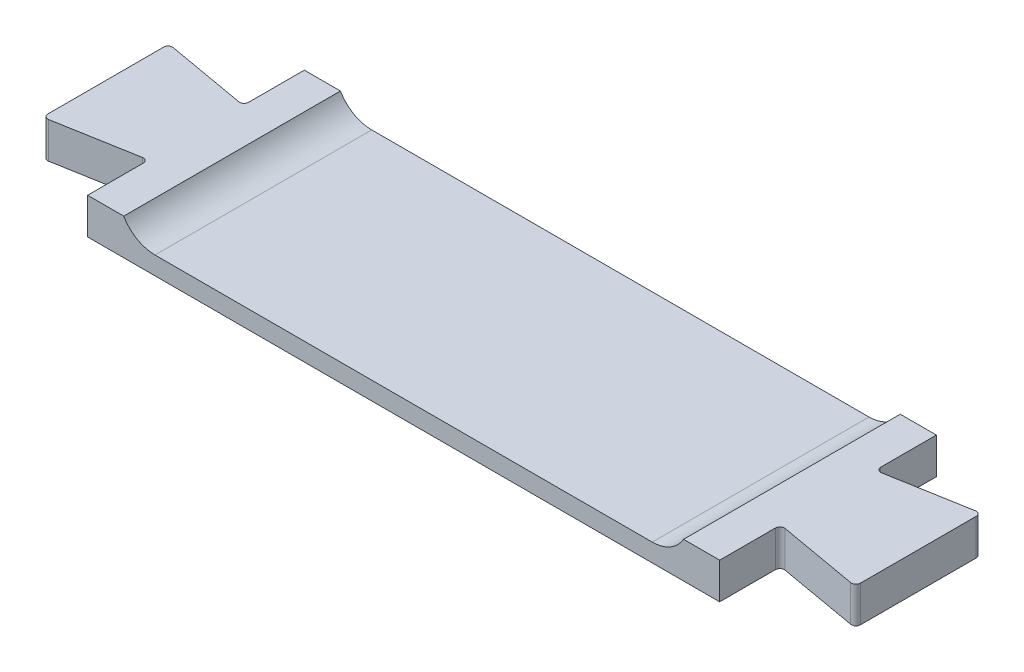
ISO-10303-21;
HEADER;
FILE_DESCRIPTION(('STEP AP214'),'2;1');
FILE_NAME('part.step','',(''),(''),'','','');
FILE_SCHEMA(('AUTOMOTIVE_DESIGN { 1 0 10303 214 1 1 1 1 }'));
ENDSEC;
DATA;
#1=APPLICATION_CONTEXT('core data for automotive mechanical design processes');
#2=APPLICATION_PROTOCOL_DEFINITION('international standard','automotive_design',2000,#1);
#3=PRODUCT_CONTEXT('',#1,'mechanical');
#4=PRODUCT('Part','Part','',(#3));
#5=PRODUCT_RELATED_PRODUCT_CATEGORY('part','',(#4));
#6=PRODUCT_DEFINITION_FORMATION('','',#4);
#7=PRODUCT_DEFINITION_CONTEXT('part definition',#1,'design');
#8=PRODUCT_DEFINITION('design','',#6,#7);
#9=PRODUCT_DEFINITION_SHAPE('','',#8);
#10=(LENGTH_UNIT() NAMED_UNIT(*) SI_UNIT(.MILLI.,.METRE.));
#11=(NAMED_UNIT(*) PLANE_ANGLE_UNIT() SI_UNIT($,.RADIAN.));
#12=(NAMED_UNIT(*) SI_UNIT($,.STERADIAN.) SOLID_ANGLE_UNIT());
#13=UNCERTAINTY_MEASURE_WITH_UNIT(LENGTH_MEASURE(1.E-05),#10,'distance_accuracy_value','');
#14=(GEOMETRIC_REPRESENTATION_CONTEXT(3) GLOBAL_UNCERTAINTY_ASSIGNED_CONTEXT((#13)) GLOBAL_UNIT_ASSIGNED_CONTEXT((#10,
#11,#12)) REPRESENTATION_CONTEXT('',''));
#15=CARTESIAN_POINT('',(0.,0.,0.));
#16=DIRECTION('',(0.,0.,1.));
#17=DIRECTION('',(1.,0.,0.));
#18=AXIS2_PLACEMENT_3D('',#15,#16,#17);
#19=CARTESIAN_POINT('',(0.,2.,0.));
#20=DIRECTION('',(0.,-1.,0.));
#21=DIRECTION('',(0.,0.,-1.));
#22=AXIS2_PLACEMENT_3D('',#19,#20,#21);
#23=PLANE('',#22);
#24=DIRECTION('',(1.,0.,0.));
#25=VECTOR('',#24,1.);
#26=CARTESIAN_POINT('',(-17.5,2.,6.));
#27=LINE('',#26,#25);
#28=CARTESIAN_POINT('',(-17.5,2.,6.));
#29=VERTEX_POINT('',#28);
#30=CARTESIAN_POINT('',(-15.5,2.,6.));
#31=VERTEX_POINT('',#30);
#32=EDGE_CURVE('E201',#29,#31,#27,.T.);
#33=ORIENTED_EDGE('',*,*,#32,.T.);
#34=DIRECTION('',(0.,0.,1.));
#35=VECTOR('',#34,1.);
#36=CARTESIAN_POINT('',(-15.5,2.,-6.));
#37=LINE('',#36,#35);
#38=CARTESIAN_POINT('',(-15.5,2.,-6.));
#39=VERTEX_POINT('',#38);
#40=EDGE_CURVE('E211',#39,#31,#37,.T.);
#41=ORIENTED_EDGE('',*,*,#40,.F.);
#42=DIRECTION('',(-1.,0.,0.));
#43=VECTOR('',#42,1.);
#44=CARTESIAN_POINT('',(-17.5,2.,-6.));
#45=LINE('',#44,#43);
#46=CARTESIAN_POINT('',(-17.5,2.,-6.));
#47=VERTEX_POINT('',#46);
#48=EDGE_CURVE('E228',#39,#47,#45,.T.);
#49=ORIENTED_EDGE('',*,*,#48,.T.);
#50=DIRECTION('',(0.,0.,1.));
#51=VECTOR('',#50,1.);
#52=CARTESIAN_POINT('',(-17.5,2.,-2.61836509645765));
#53=LINE('',#52,#51);
#54=CARTESIAN_POINT('',(-17.5,2.,-2.91630349460621));
#55=VERTEX_POINT('',#54);
#56=EDGE_CURVE('E233',#47,#55,#53,.T.);
#57=ORIENTED_EDGE('',*,*,#56,.T.);
#58=CARTESIAN_POINT('',(-17.75,2.,-2.91630349460621));
#59=DIRECTION('',(0.,-1.,0.));
#60=DIRECTION('',(0.,0.,-1.));
#61=AXIS2_PLACEMENT_3D('',#58,#59,#60);
#62=CIRCLE('',#61,0.25);
#63=CARTESIAN_POINT('',(-17.7934120444167,2.,-2.67010155635315));
#64=VERTEX_POINT('',#63);
#65=EDGE_CURVE('E361',#55,#64,#62,.T.);
#66=ORIENTED_EDGE('',*,*,#65,.T.);
#67=DIRECTION('',(-0.984807753012207,0.,-0.173648177666934));
#68=VECTOR('',#67,1.);
#69=CARTESIAN_POINT('',(-17.5,2.,-2.61836509645765));
#70=LINE('',#69,#68);
#71=CARTESIAN_POINT('',(-22.2065879555833,2.,-3.4482635401045));
#72=VERTEX_POINT('',#71);
#73=EDGE_CURVE('E236',#64,#72,#70,.T.);
#74=ORIENTED_EDGE('',*,*,#73,.T.);
#75=CARTESIAN_POINT('',(-22.25,2.,-3.20206160185144));
#76=DIRECTION('',(0.,-1.,0.));
#77=DIRECTION('',(0.,0.,-1.));
#78=AXIS2_PLACEMENT_3D('',#75,#76,#77);
#79=CIRCLE('',#78,0.25);
#80=CARTESIAN_POINT('',(-22.5,2.,-3.20206160185144));
#81=VERTEX_POINT('',#80);
#82=EDGE_CURVE('E324',#72,#81,#79,.F.);
#83=ORIENTED_EDGE('',*,*,#82,.T.);
#84=DIRECTION('',(0.,0.,1.));
#85=VECTOR('',#84,1.);
#86=CARTESIAN_POINT('',(-22.5,2.,-3.5));
#87=LINE('',#86,#85);
#88=CARTESIAN_POINT('',(-22.5,2.,3.20206160185145));
#89=VERTEX_POINT('',#88);
#90=EDGE_CURVE('E239',#81,#89,#87,.T.);
#91=ORIENTED_EDGE('',*,*,#90,.T.);
#92=CARTESIAN_POINT('',(-22.25,2.,3.20206160185145));
#93=DIRECTION('',(0.,-1.,0.));
#94=DIRECTION('',(0.,0.,-1.));
#95=AXIS2_PLACEMENT_3D('',#92,#93,#94);
#96=CIRCLE('',#95,0.25);
#97=CARTESIAN_POINT('',(-22.2065879555833,2.,3.4482635401045));
#98=VERTEX_POINT('',#97);
#99=EDGE_CURVE('E326',#89,#98,#96,.F.);
#100=ORIENTED_EDGE('',*,*,#99,.T.);
#101=DIRECTION('',(0.984807753012207,0.,-0.173648177666935));
#102=VECTOR('',#101,1.);
#103=CARTESIAN_POINT('',(-17.5,2.,2.61836509645765));
#104=LINE('',#103,#102);
#105=CARTESIAN_POINT('',(-17.7934120444167,2.,2.67010155635316));
#106=VERTEX_POINT('',#105);
#107=EDGE_CURVE('E242',#98,#106,#104,.T.);
#108=ORIENTED_EDGE('',*,*,#107,.T.);
#109=CARTESIAN_POINT('',(-17.75,2.,2.91630349460621));
#110=DIRECTION('',(0.,-1.,0.));
#111=DIRECTION('',(0.,0.,-1.));
#112=AXIS2_PLACEMENT_3D('',#109,#110,#111);
#113=CIRCLE('',#112,0.25);
#114=CARTESIAN_POINT('',(-17.5,2.,2.91630349460621));
#115=VERTEX_POINT('',#114);
#116=EDGE_CURVE('E357',#106,#115,#113,.T.);
#117=ORIENTED_EDGE('',*,*,#116,.T.);
#118=DIRECTION('',(0.,0.,1.));
#119=VECTOR('',#118,1.);
#120=CARTESIAN_POINT('',(-17.5,2.,6.));
#121=LINE('',#120,#119);
#122=EDGE_CURVE('E213',#115,#29,#121,.T.);
#123=ORIENTED_EDGE('',*,*,#122,.T.);
#124=EDGE_LOOP('',(#33,#41,#49,#57,#66,#74,#83,#91,#100,#108,#117,#123));
#125=FACE_BOUND('',#124,.T.);
#126=ADVANCED_FACE('F35',(#125),#23,.F.);
#127=CARTESIAN_POINT('',(17.5,2.,-2.61836509645766));
#128=DIRECTION('',(-1.,0.,0.));
#129=DIRECTION('',(0.,0.,1.));
#130=AXIS2_PLACEMENT_3D('',#127,#128,#129);
#131=PLANE('',#130);
#132=DIRECTION('',(0.,0.,-1.));
#133=VECTOR('',#132,1.);
#134=CARTESIAN_POINT('',(17.5,2.,-2.61836509645766));
#135=LINE('',#134,#133);
#136=CARTESIAN_POINT('',(17.5,2.,-2.91630349460621));
#137=VERTEX_POINT('',#136);
#138=CARTESIAN_POINT('',(17.5,2.,-6.));
#139=VERTEX_POINT('',#138);
#140=EDGE_CURVE('E226',#137,#139,#135,.T.);
#141=ORIENTED_EDGE('',*,*,#140,.F.);
#142=DIRECTION('',(0.,-1.,0.));
#143=VECTOR('',#142,1.);
#144=CARTESIAN_POINT('',(17.5,0.,-2.91630349460621));
#145=LINE('',#144,#143);
#146=CARTESIAN_POINT('',(17.5,0.,-2.91630349460621));
#147=VERTEX_POINT('',#146);
#148=EDGE_CURVE('E335',#137,#147,#145,.T.);
#149=ORIENTED_EDGE('',*,*,#148,.T.);
#150=DIRECTION('',(0.,0.,-1.));
#151=VECTOR('',#150,1.);
#152=CARTESIAN_POINT('',(17.5,0.,-2.61836509645766));
#153=LINE('',#152,#151);
#154=CARTESIAN_POINT('',(17.5,0.,-6.));
#155=VERTEX_POINT('',#154);
#156=EDGE_CURVE('E258',#147,#155,#153,.T.);
#157=ORIENTED_EDGE('',*,*,#156,.T.);
#158=DIRECTION('',(0.,-1.,0.));
#159=VECTOR('',#158,1.);
#160=CARTESIAN_POINT('',(17.5,2.,-6.));
#161=LINE('',#160,#159);
#162=EDGE_CURVE('E296',#139,#155,#161,.T.);
#163=ORIENTED_EDGE('',*,*,#162,.F.);
#164=EDGE_LOOP('',(#141,#149,#157,#163));
#165=FACE_BOUND('',#164,.T.);
#166=ADVANCED_FACE('F397',(#165),#131,.F.);
#167=CARTESIAN_POINT('',(-17.5,2.,-6.));
#168=DIRECTION('',(0.,0.,1.));
#169=DIRECTION('',(1.,0.,0.));
#170=AXIS2_PLACEMENT_3D('',#167,#168,#169);
#171=PLANE('',#170);
#172=ORIENTED_EDGE('',*,*,#48,.F.);
#173=CARTESIAN_POINT('',(-13.7679491924311,3.,-6.));
#174=DIRECTION('',(0.,0.,1.));
#175=DIRECTION('',(1.,0.,0.));
#176=AXIS2_PLACEMENT_3D('',#173,#174,#175);
#177=CIRCLE('',#176,2.);
#178=CARTESIAN_POINT('',(-13.7679491924311,1.,-6.));
#179=VERTEX_POINT('',#178);
#180=EDGE_CURVE('E50',#39,#179,#177,.T.);
#181=ORIENTED_EDGE('',*,*,#180,.T.);
#182=DIRECTION('',(-1.,0.,0.));
#183=VECTOR('',#182,1.);
#184=CARTESIAN_POINT('',(-15.5,1.,-6.));
#185=LINE('',#184,#183);
#186=CARTESIAN_POINT('',(13.7679491924311,1.,-6.));
#187=VERTEX_POINT('',#186);
#188=EDGE_CURVE('E223',#187,#179,#185,.T.);
#189=ORIENTED_EDGE('',*,*,#188,.F.);
#190=CARTESIAN_POINT('',(13.7679491924311,3.,-6.));
#191=DIRECTION('',(0.,0.,1.));
#192=DIRECTION('',(1.,0.,0.));
#193=AXIS2_PLACEMENT_3D('',#190,#191,#192);
#194=CIRCLE('',#193,2.);
#195=CARTESIAN_POINT('',(15.5,2.,-6.));
#196=VERTEX_POINT('',#195);
#197=EDGE_CURVE('E43',#187,#196,#194,.T.);
#198=ORIENTED_EDGE('',*,*,#197,.T.);
#199=EDGE_CURVE('E230',#139,#196,#45,.T.);
#200=ORIENTED_EDGE('',*,*,#199,.F.);
#201=ORIENTED_EDGE('',*,*,#162,.T.);
#202=DIRECTION('',(-1.,0.,0.));
#203=VECTOR('',#202,1.);
#204=CARTESIAN_POINT('',(-17.5,0.,-6.));
#205=LINE('',#204,#203);
#206=CARTESIAN_POINT('',(-17.5,0.,-6.));
#207=VERTEX_POINT('',#206);
#208=EDGE_CURVE('E260',#155,#207,#205,.T.);
#209=ORIENTED_EDGE('',*,*,#208,.T.);
#210=DIRECTION('',(0.,-1.,0.));
#211=VECTOR('',#210,1.);
#212=CARTESIAN_POINT('',(-17.5,2.,-6.));
#213=LINE('',#212,#211);
#214=EDGE_CURVE('E293',#47,#207,#213,.T.);
#215=ORIENTED_EDGE('',*,*,#214,.F.);
#216=EDGE_LOOP('',(#172,#181,#189,#198,#200,#201,#209,#215));
#217=FACE_BOUND('',#216,.T.);
#218=ADVANCED_FACE('F375',(#217),#171,.F.);
#219=CARTESIAN_POINT('',(-17.5,2.,-2.61836509645765));
#220=DIRECTION('',(1.,0.,0.));
#221=DIRECTION('',(0.,0.,-1.));
#222=AXIS2_PLACEMENT_3D('',#219,#220,#221);
#223=PLANE('',#222);
#224=DIRECTION('',(0.,0.,1.));
#225=VECTOR('',#224,1.);
#226=CARTESIAN_POINT('',(-17.5,0.,-2.61836509645765));
#227=LINE('',#226,#225);
#228=CARTESIAN_POINT('',(-17.5,0.,-2.91630349460621));
#229=VERTEX_POINT('',#228);
#230=EDGE_CURVE('E262',#207,#229,#227,.T.);
#231=ORIENTED_EDGE('',*,*,#230,.T.);
#232=DIRECTION('',(0.,-1.,0.));
#233=VECTOR('',#232,1.);
#234=CARTESIAN_POINT('',(-17.5,2.,-2.91630349460621));
#235=LINE('',#234,#233);
#236=EDGE_CURVE('E333',#229,#55,#235,.F.);
#237=ORIENTED_EDGE('',*,*,#236,.T.);
#238=ORIENTED_EDGE('',*,*,#56,.F.);
#239=ORIENTED_EDGE('',*,*,#214,.T.);
#240=EDGE_LOOP('',(#231,#237,#238,#239));
#241=FACE_BOUND('',#240,.T.);
#242=ADVANCED_FACE('F447',(#241),#223,.F.);
#243=CARTESIAN_POINT('',(-17.5,2.,-2.61836509645765));
#244=DIRECTION('',(-0.173648177666934,0.,0.984807753012207));
#245=DIRECTION('',(0.984807753012208,0.,0.173648177666934));
#246=AXIS2_PLACEMENT_3D('',#243,#244,#245);
#247=PLANE('',#246);
#248=DIRECTION('',(-0.984807753012207,0.,-0.173648177666934));
#249=VECTOR('',#248,1.);
#250=CARTESIAN_POINT('',(-17.5,0.,-2.61836509645765));
#251=LINE('',#250,#249);
#252=CARTESIAN_POINT('',(-17.7934120444167,0.,-2.67010155635315));
#253=VERTEX_POINT('',#252);
#254=CARTESIAN_POINT('',(-22.2065879555833,0.,-3.4482635401045));
#255=VERTEX_POINT('',#254);
#256=EDGE_CURVE('E265',#253,#255,#251,.T.);
#257=ORIENTED_EDGE('',*,*,#256,.T.);
#258=DIRECTION('',(0.,-1.,0.));
#259=VECTOR('',#258,1.);
#260=CARTESIAN_POINT('',(-22.2065879555833,2.,-3.4482635401045));
#261=LINE('',#260,#259);
#262=EDGE_CURVE('E331',#255,#72,#261,.F.);
#263=ORIENTED_EDGE('',*,*,#262,.T.);
#264=ORIENTED_EDGE('',*,*,#73,.F.);
#265=DIRECTION('',(0.,-1.,0.));
#266=VECTOR('',#265,1.);
#267=CARTESIAN_POINT('',(-17.7934120444167,0.,-2.67010155635315));
#268=LINE('',#267,#266);
#269=EDGE_CURVE('E328',#64,#253,#268,.T.);
#270=ORIENTED_EDGE('',*,*,#269,.T.);
#271=EDGE_LOOP('',(#257,#263,#264,#270));
#272=FACE_BOUND('',#271,.T.);
#273=ADVANCED_FACE('F443',(#272),#247,.F.);
#274=CARTESIAN_POINT('',(-22.5,2.,-3.5));
#275=DIRECTION('',(1.,0.,0.));
#276=DIRECTION('',(0.,0.,-1.));
#277=AXIS2_PLACEMENT_3D('',#274,#275,#276);
#278=PLANE('',#277);
#279=DIRECTION('',(0.,0.,1.));
#280=VECTOR('',#279,1.);
#281=CARTESIAN_POINT('',(-22.5,0.,-3.5));
#282=LINE('',#281,#280);
#283=CARTESIAN_POINT('',(-22.5,0.,-3.20206160185144));
#284=VERTEX_POINT('',#283);
#285=CARTESIAN_POINT('',(-22.5,0.,3.20206160185145));
#286=VERTEX_POINT('',#285);
#287=EDGE_CURVE('E268',#284,#286,#282,.T.);
#288=ORIENTED_EDGE('',*,*,#287,.T.);
#289=DIRECTION('',(0.,-1.,0.));
#290=VECTOR('',#289,1.);
#291=CARTESIAN_POINT('',(-22.5,2.,3.20206160185145));
#292=LINE('',#291,#290);
#293=EDGE_CURVE('E318',#286,#89,#292,.F.);
#294=ORIENTED_EDGE('',*,*,#293,.T.);
#295=ORIENTED_EDGE('',*,*,#90,.F.);
#296=DIRECTION('',(0.,-1.,0.));
#297=VECTOR('',#296,1.);
#298=CARTESIAN_POINT('',(-22.5,2.,-3.20206160185144));
#299=LINE('',#298,#297);
#300=EDGE_CURVE('E315',#81,#284,#299,.T.);
#301=ORIENTED_EDGE('',*,*,#300,.T.);
#302=EDGE_LOOP('',(#288,#294,#295,#301));
#303=FACE_BOUND('',#302,.T.);
#304=ADVANCED_FACE('F439',(#303),#278,.F.);
#305=CARTESIAN_POINT('',(-17.5,2.,2.61836509645765));
#306=DIRECTION('',(-0.173648177666935,0.,-0.984807753012207));
#307=DIRECTION('',(-0.984807753012207,0.,0.173648177666935));
#308=AXIS2_PLACEMENT_3D('',#305,#306,#307);
#309=PLANE('',#308);
#310=DIRECTION('',(0.984807753012207,0.,-0.173648177666935));
#311=VECTOR('',#310,1.);
#312=CARTESIAN_POINT('',(-17.5,0.,2.61836509645765));
#313=LINE('',#312,#311);
#314=CARTESIAN_POINT('',(-22.2065879555833,0.,3.4482635401045));
#315=VERTEX_POINT('',#314);
#316=CARTESIAN_POINT('',(-17.7934120444167,0.,2.67010155635316));
#317=VERTEX_POINT('',#316);
#318=EDGE_CURVE('E271',#315,#317,#313,.T.);
#319=ORIENTED_EDGE('',*,*,#318,.T.);
#320=DIRECTION('',(0.,-1.,0.));
#321=VECTOR('',#320,1.);
#322=CARTESIAN_POINT('',(-17.7934120444167,2.,2.67010155635316));
#323=LINE('',#322,#321);
#324=EDGE_CURVE('E305',#317,#106,#323,.F.);
#325=ORIENTED_EDGE('',*,*,#324,.T.);
#326=ORIENTED_EDGE('',*,*,#107,.F.);
#327=DIRECTION('',(0.,-1.,0.));
#328=VECTOR('',#327,1.);
#329=CARTESIAN_POINT('',(-22.2065879555833,2.,3.4482635401045));
#330=LINE('',#329,#328);
#331=EDGE_CURVE('E302',#98,#315,#330,.T.);
#332=ORIENTED_EDGE('',*,*,#331,.T.);
#333=EDGE_LOOP('',(#319,#325,#326,#332));
#334=FACE_BOUND('',#333,.T.);
#335=ADVANCED_FACE('F435',(#334),#309,.F.);
#336=CARTESIAN_POINT('',(-17.5,2.,6.));
#337=DIRECTION('',(1.,0.,0.));
#338=DIRECTION('',(0.,0.,-1.));
#339=AXIS2_PLACEMENT_3D('',#336,#337,#338);
#340=PLANE('',#339);
#341=ORIENTED_EDGE('',*,*,#122,.F.);
#342=DIRECTION('',(0.,-1.,0.));
#343=VECTOR('',#342,1.);
#344=CARTESIAN_POINT('',(-17.5,0.,2.91630349460621));
#345=LINE('',#344,#343);
#346=CARTESIAN_POINT('',(-17.5,0.,2.91630349460621));
#347=VERTEX_POINT('',#346);
#348=EDGE_CURVE('E299',#115,#347,#345,.T.);
#349=ORIENTED_EDGE('',*,*,#348,.T.);
#350=DIRECTION('',(0.,0.,1.));
#351=VECTOR('',#350,1.);
#352=CARTESIAN_POINT('',(-17.5,0.,6.));
#353=LINE('',#352,#351);
#354=CARTESIAN_POINT('',(-17.5,0.,6.));
#355=VERTEX_POINT('',#354);
#356=EDGE_CURVE('E274',#347,#355,#353,.T.);
#357=ORIENTED_EDGE('',*,*,#356,.T.);
#358=DIRECTION('',(0.,-1.,0.));
#359=VECTOR('',#358,1.);
#360=CARTESIAN_POINT('',(-17.5,2.,6.));
#361=LINE('',#360,#359);
#362=EDGE_CURVE('E291',#29,#355,#361,.T.);
#363=ORIENTED_EDGE('',*,*,#362,.F.);
#364=EDGE_LOOP('',(#341,#349,#357,#363));
#365=FACE_BOUND('',#364,.T.);
#366=ADVANCED_FACE('F432',(#365),#340,.F.);
#367=CARTESIAN_POINT('',(-17.5,2.,6.));
#368=DIRECTION('',(0.,0.,-1.));
#369=DIRECTION('',(-1.,0.,0.));
#370=AXIS2_PLACEMENT_3D('',#367,#368,#369);
#371=PLANE('',#370);
#372=DIRECTION('',(1.,0.,0.));
#373=VECTOR('',#372,1.);
#374=CARTESIAN_POINT('',(-15.5,1.,6.));
#375=LINE('',#374,#373);
#376=CARTESIAN_POINT('',(-13.7679491924311,1.,6.));
#377=VERTEX_POINT('',#376);
#378=CARTESIAN_POINT('',(13.7679491924311,1.,6.));
#379=VERTEX_POINT('',#378);
#380=EDGE_CURVE('E203',#377,#379,#375,.T.);
#381=ORIENTED_EDGE('',*,*,#380,.F.);
#382=CARTESIAN_POINT('',(-13.7679491924311,3.,6.));
#383=DIRECTION('',(0.,0.,-1.));
#384=DIRECTION('',(-1.,0.,0.));
#385=AXIS2_PLACEMENT_3D('',#382,#383,#384);
#386=CIRCLE('',#385,2.);
#387=EDGE_CURVE('E197',#377,#31,#386,.T.);
#388=ORIENTED_EDGE('',*,*,#387,.T.);
#389=ORIENTED_EDGE('',*,*,#32,.F.);
#390=ORIENTED_EDGE('',*,*,#362,.T.);
#391=DIRECTION('',(1.,0.,0.));
#392=VECTOR('',#391,1.);
#393=CARTESIAN_POINT('',(-17.5,0.,6.));
#394=LINE('',#393,#392);
#395=CARTESIAN_POINT('',(17.5,0.,6.));
#396=VERTEX_POINT('',#395);
#397=EDGE_CURVE('E276',#355,#396,#394,.T.);
#398=ORIENTED_EDGE('',*,*,#397,.T.);
#399=DIRECTION('',(0.,-1.,0.));
#400=VECTOR('',#399,1.);
#401=CARTESIAN_POINT('',(17.5,2.,6.));
#402=LINE('',#401,#400);
#403=CARTESIAN_POINT('',(17.5,2.,6.));
#404=VERTEX_POINT('',#403);
#405=EDGE_CURVE('E257',#404,#396,#402,.T.);
#406=ORIENTED_EDGE('',*,*,#405,.F.);
#407=CARTESIAN_POINT('',(15.5,2.,6.));
#408=VERTEX_POINT('',#407);
#409=EDGE_CURVE('E216',#408,#404,#27,.T.);
#410=ORIENTED_EDGE('',*,*,#409,.F.);
#411=CARTESIAN_POINT('',(13.7679491924311,3.,6.));
#412=DIRECTION('',(0.,0.,-1.));
#413=DIRECTION('',(-1.,0.,0.));
#414=AXIS2_PLACEMENT_3D('',#411,#412,#413);
#415=CIRCLE('',#414,2.);
#416=EDGE_CURVE('E11',#408,#379,#415,.T.);
#417=ORIENTED_EDGE('',*,*,#416,.T.);
#418=EDGE_LOOP('',(#381,#388,#389,#390,#398,#406,#410,#417));
#419=FACE_BOUND('',#418,.T.);
#420=ADVANCED_FACE('F199',(#419),#371,.F.);
#421=CARTESIAN_POINT('',(17.5,2.,6.));
#422=DIRECTION('',(-1.,0.,0.));
#423=DIRECTION('',(0.,0.,1.));
#424=AXIS2_PLACEMENT_3D('',#421,#422,#423);
#425=PLANE('',#424);
#426=DIRECTION('',(0.,0.,-1.));
#427=VECTOR('',#426,1.);
#428=CARTESIAN_POINT('',(17.5,0.,6.));
#429=LINE('',#428,#427);
#430=CARTESIAN_POINT('',(17.5,0.,2.91630349460621));
#431=VERTEX_POINT('',#430);
#432=EDGE_CURVE('E278',#396,#431,#429,.T.);
#433=ORIENTED_EDGE('',*,*,#432,.T.);
#434=DIRECTION('',(0.,-1.,0.));
#435=VECTOR('',#434,1.);
#436=CARTESIAN_POINT('',(17.5,2.,2.91630349460621));
#437=LINE('',#436,#435);
#438=CARTESIAN_POINT('',(17.5,2.,2.91630349460621));
#439=VERTEX_POINT('',#438);
#440=EDGE_CURVE('E353',#431,#439,#437,.F.);
#441=ORIENTED_EDGE('',*,*,#440,.T.);
#442=DIRECTION('',(0.,0.,-1.));
#443=VECTOR('',#442,1.);
#444=CARTESIAN_POINT('',(17.5,2.,6.));
#445=LINE('',#444,#443);
#446=EDGE_CURVE('E215',#404,#439,#445,.T.);
#447=ORIENTED_EDGE('',*,*,#446,.F.);
#448=ORIENTED_EDGE('',*,*,#405,.T.);
#449=EDGE_LOOP('',(#433,#441,#447,#448));
#450=FACE_BOUND('',#449,.T.);
#451=ADVANCED_FACE('F425',(#450),#425,.F.);
#452=CARTESIAN_POINT('',(17.5,2.,2.61836509645765));
#453=DIRECTION('',(0.173648177666935,0.,-0.984807753012207));
#454=DIRECTION('',(-0.984807753012207,0.,-0.173648177666935));
#455=AXIS2_PLACEMENT_3D('',#452,#453,#454);
#456=PLANE('',#455);
#457=DIRECTION('',(0.984807753012207,0.,0.173648177666935));
#458=VECTOR('',#457,1.);
#459=CARTESIAN_POINT('',(17.5,0.,2.61836509645765));
#460=LINE('',#459,#458);
#461=CARTESIAN_POINT('',(17.7934120444167,0.,2.67010155635316));
#462=VERTEX_POINT('',#461);
#463=CARTESIAN_POINT('',(22.2065879555833,0.,3.4482635401045));
#464=VERTEX_POINT('',#463);
#465=EDGE_CURVE('E281',#462,#464,#460,.T.);
#466=ORIENTED_EDGE('',*,*,#465,.T.);
#467=DIRECTION('',(0.,-1.,0.));
#468=VECTOR('',#467,1.);
#469=CARTESIAN_POINT('',(22.2065879555833,2.,3.4482635401045));
#470=LINE('',#469,#468);
#471=CARTESIAN_POINT('',(22.2065879555833,2.,3.4482635401045));
#472=VERTEX_POINT('',#471);
#473=EDGE_CURVE('E351',#464,#472,#470,.F.);
#474=ORIENTED_EDGE('',*,*,#473,.T.);
#475=DIRECTION('',(0.984807753012207,0.,0.173648177666935));
#476=VECTOR('',#475,1.);
#477=CARTESIAN_POINT('',(17.5,2.,2.61836509645765));
#478=LINE('',#477,#476);
#479=CARTESIAN_POINT('',(17.7934120444167,2.,2.67010155635316));
#480=VERTEX_POINT('',#479);
#481=EDGE_CURVE('E248',#480,#472,#478,.T.);
#482=ORIENTED_EDGE('',*,*,#481,.F.);
#483=DIRECTION('',(0.,-1.,0.));
#484=VECTOR('',#483,1.);
#485=CARTESIAN_POINT('',(17.7934120444167,0.,2.67010155635316));
#486=LINE('',#485,#484);
#487=EDGE_CURVE('E348',#480,#462,#486,.T.);
#488=ORIENTED_EDGE('',*,*,#487,.T.);
#489=EDGE_LOOP('',(#466,#474,#482,#488));
#490=FACE_BOUND('',#489,.T.);
#491=ADVANCED_FACE('F419',(#490),#456,.F.);
#492=CARTESIAN_POINT('',(22.5,2.,-3.50000000000001));
#493=DIRECTION('',(-1.,0.,0.));
#494=DIRECTION('',(0.,0.,1.));
#495=AXIS2_PLACEMENT_3D('',#492,#493,#494);
#496=PLANE('',#495);
#497=DIRECTION('',(0.,0.,-1.));
#498=VECTOR('',#497,1.);
#499=CARTESIAN_POINT('',(22.5,0.,-3.50000000000001));
#500=LINE('',#499,#498);
#501=CARTESIAN_POINT('',(22.5,0.,3.20206160185145));
#502=VERTEX_POINT('',#501);
#503=CARTESIAN_POINT('',(22.5,0.,-3.20206160185146));
#504=VERTEX_POINT('',#503);
#505=EDGE_CURVE('E284',#502,#504,#500,.T.);
#506=ORIENTED_EDGE('',*,*,#505,.T.);
#507=DIRECTION('',(0.,-1.,0.));
#508=VECTOR('',#507,1.);
#509=CARTESIAN_POINT('',(22.5,2.,-3.20206160185146));
#510=LINE('',#509,#508);
#511=CARTESIAN_POINT('',(22.5,2.,-3.20206160185146));
#512=VERTEX_POINT('',#511);
#513=EDGE_CURVE('E346',#504,#512,#510,.F.);
#514=ORIENTED_EDGE('',*,*,#513,.T.);
#515=DIRECTION('',(0.,0.,-1.));
#516=VECTOR('',#515,1.);
#517=CARTESIAN_POINT('',(22.5,2.,-3.50000000000001));
#518=LINE('',#517,#516);
#519=CARTESIAN_POINT('',(22.5,2.,3.20206160185145));
#520=VERTEX_POINT('',#519);
#521=EDGE_CURVE('E251',#520,#512,#518,.T.);
#522=ORIENTED_EDGE('',*,*,#521,.F.);
#523=DIRECTION('',(0.,-1.,0.));
#524=VECTOR('',#523,1.);
#525=CARTESIAN_POINT('',(22.5,2.,3.20206160185145));
#526=LINE('',#525,#524);
#527=EDGE_CURVE('E343',#520,#502,#526,.T.);
#528=ORIENTED_EDGE('',*,*,#527,.T.);
#529=EDGE_LOOP('',(#506,#514,#522,#528));
#530=FACE_BOUND('',#529,.T.);
#531=ADVANCED_FACE('F413',(#530),#496,.F.);
#532=CARTESIAN_POINT('',(17.5,2.,-2.61836509645766));
#533=DIRECTION('',(0.173648177666935,0.,0.984807753012207));
#534=DIRECTION('',(0.984807753012207,0.,-0.173648177666935));
#535=AXIS2_PLACEMENT_3D('',#532,#533,#534);
#536=PLANE('',#535);
#537=DIRECTION('',(-0.984807753012207,0.,0.173648177666935));
#538=VECTOR('',#537,1.);
#539=CARTESIAN_POINT('',(17.5,0.,-2.61836509645766));
#540=LINE('',#539,#538);
#541=CARTESIAN_POINT('',(22.2065879555833,0.,-3.44826354010451));
#542=VERTEX_POINT('',#541);
#543=CARTESIAN_POINT('',(17.7934120444167,0.,-2.67010155635316));
#544=VERTEX_POINT('',#543);
#545=EDGE_CURVE('E229',#542,#544,#540,.T.);
#546=ORIENTED_EDGE('',*,*,#545,.T.);
#547=DIRECTION('',(0.,-1.,0.));
#548=VECTOR('',#547,1.);
#549=CARTESIAN_POINT('',(17.7934120444167,2.,-2.67010155635316));
#550=LINE('',#549,#548);
#551=CARTESIAN_POINT('',(17.7934120444167,2.,-2.67010155635316));
#552=VERTEX_POINT('',#551);
#553=EDGE_CURVE('E341',#544,#552,#550,.F.);
#554=ORIENTED_EDGE('',*,*,#553,.T.);
#555=DIRECTION('',(-0.984807753012207,0.,0.173648177666935));
#556=VECTOR('',#555,1.);
#557=CARTESIAN_POINT('',(17.5,2.,-2.61836509645766));
#558=LINE('',#557,#556);
#559=CARTESIAN_POINT('',(22.2065879555833,2.,-3.44826354010451));
#560=VERTEX_POINT('',#559);
#561=EDGE_CURVE('E254',#560,#552,#558,.T.);
#562=ORIENTED_EDGE('',*,*,#561,.F.);
#563=DIRECTION('',(0.,-1.,0.));
#564=VECTOR('',#563,1.);
#565=CARTESIAN_POINT('',(22.2065879555833,2.,-3.44826354010451));
#566=LINE('',#565,#564);
#567=EDGE_CURVE('E338',#560,#542,#566,.T.);
#568=ORIENTED_EDGE('',*,*,#567,.T.);
#569=EDGE_LOOP('',(#546,#554,#562,#568));
#570=FACE_BOUND('',#569,.T.);
#571=ADVANCED_FACE('F406',(#570),#536,.F.);
#572=ORIENTED_EDGE('',*,*,#199,.T.);
#573=DIRECTION('',(0.,0.,-1.));
#574=VECTOR('',#573,1.);
#575=CARTESIAN_POINT('',(15.5,2.,-6.));
#576=LINE('',#575,#574);
#577=EDGE_CURVE('E219',#408,#196,#576,.T.);
#578=ORIENTED_EDGE('',*,*,#577,.F.);
#579=ORIENTED_EDGE('',*,*,#409,.T.);
#580=ORIENTED_EDGE('',*,*,#446,.T.);
#581=CARTESIAN_POINT('',(17.75,2.,2.91630349460621));
#582=DIRECTION('',(0.,-1.,0.));
#583=DIRECTION('',(0.,0.,-1.));
#584=AXIS2_PLACEMENT_3D('',#581,#582,#583);
#585=CIRCLE('',#584,0.25);
#586=EDGE_CURVE('E369',#439,#480,#585,.T.);
#587=ORIENTED_EDGE('',*,*,#586,.T.);
#588=ORIENTED_EDGE('',*,*,#481,.T.);
#589=CARTESIAN_POINT('',(22.25,2.,3.20206160185145));
#590=DIRECTION('',(0.,-1.,0.));
#591=DIRECTION('',(0.,0.,-1.));
#592=AXIS2_PLACEMENT_3D('',#589,#590,#591);
#593=CIRCLE('',#592,0.25);
#594=EDGE_CURVE('E320',#472,#520,#593,.F.);
#595=ORIENTED_EDGE('',*,*,#594,.T.);
#596=ORIENTED_EDGE('',*,*,#521,.T.);
#597=CARTESIAN_POINT('',(22.25,2.,-3.20206160185146));
#598=DIRECTION('',(0.,-1.,0.));
#599=DIRECTION('',(0.,0.,-1.));
#600=AXIS2_PLACEMENT_3D('',#597,#598,#599);
#601=CIRCLE('',#600,0.25);
#602=EDGE_CURVE('E322',#512,#560,#601,.F.);
#603=ORIENTED_EDGE('',*,*,#602,.T.);
#604=ORIENTED_EDGE('',*,*,#561,.T.);
#605=CARTESIAN_POINT('',(17.75,2.,-2.91630349460621));
#606=DIRECTION('',(0.,-1.,0.));
#607=DIRECTION('',(0.,0.,-1.));
#608=AXIS2_PLACEMENT_3D('',#605,#606,#607);
#609=CIRCLE('',#608,0.25);
#610=EDGE_CURVE('E365',#552,#137,#609,.T.);
#611=ORIENTED_EDGE('',*,*,#610,.T.);
#612=ORIENTED_EDGE('',*,*,#140,.T.);
#613=EDGE_LOOP('',(#572,#578,#579,#580,#587,#588,#595,#596,#603,#604,#611,#612));
#614=FACE_BOUND('',#613,.T.);
#615=ADVANCED_FACE('F378',(#614),#23,.F.);
#616=CARTESIAN_POINT('',(0.,0.,0.));
#617=DIRECTION('',(0.,-1.,0.));
#618=DIRECTION('',(0.,0.,-1.));
#619=AXIS2_PLACEMENT_3D('',#616,#617,#618);
#620=PLANE('',#619);
#621=ORIENTED_EDGE('',*,*,#318,.F.);
#622=CARTESIAN_POINT('',(-22.25,0.,3.20206160185145));
#623=DIRECTION('',(0.,-1.,0.));
#624=DIRECTION('',(0.,0.,-1.));
#625=AXIS2_PLACEMENT_3D('',#622,#623,#624);
#626=CIRCLE('',#625,0.25);
#627=EDGE_CURVE('E313',#315,#286,#626,.T.);
#628=ORIENTED_EDGE('',*,*,#627,.T.);
#629=ORIENTED_EDGE('',*,*,#287,.F.);
#630=CARTESIAN_POINT('',(-22.25,0.,-3.20206160185144));
#631=DIRECTION('',(0.,-1.,0.));
#632=DIRECTION('',(0.,0.,-1.));
#633=AXIS2_PLACEMENT_3D('',#630,#631,#632);
#634=CIRCLE('',#633,0.25);
#635=EDGE_CURVE('E311',#284,#255,#634,.T.);
#636=ORIENTED_EDGE('',*,*,#635,.T.);
#637=ORIENTED_EDGE('',*,*,#256,.F.);
#638=CARTESIAN_POINT('',(-17.75,0.,-2.91630349460621));
#639=DIRECTION('',(0.,-1.,0.));
#640=DIRECTION('',(0.,0.,-1.));
#641=AXIS2_PLACEMENT_3D('',#638,#639,#640);
#642=CIRCLE('',#641,0.25);
#643=EDGE_CURVE('E359',#253,#229,#642,.F.);
#644=ORIENTED_EDGE('',*,*,#643,.T.);
#645=ORIENTED_EDGE('',*,*,#230,.F.);
#646=ORIENTED_EDGE('',*,*,#208,.F.);
#647=ORIENTED_EDGE('',*,*,#156,.F.);
#648=CARTESIAN_POINT('',(17.75,0.,-2.91630349460621));
#649=DIRECTION('',(0.,-1.,0.));
#650=DIRECTION('',(0.,0.,-1.));
#651=AXIS2_PLACEMENT_3D('',#648,#649,#650);
#652=CIRCLE('',#651,0.25);
#653=EDGE_CURVE('E363',#147,#544,#652,.F.);
#654=ORIENTED_EDGE('',*,*,#653,.T.);
#655=ORIENTED_EDGE('',*,*,#545,.F.);
#656=CARTESIAN_POINT('',(22.25,0.,-3.20206160185146));
#657=DIRECTION('',(0.,-1.,0.));
#658=DIRECTION('',(0.,0.,-1.));
#659=AXIS2_PLACEMENT_3D('',#656,#657,#658);
#660=CIRCLE('',#659,0.25);
#661=EDGE_CURVE('E309',#542,#504,#660,.T.);
#662=ORIENTED_EDGE('',*,*,#661,.T.);
#663=ORIENTED_EDGE('',*,*,#505,.F.);
#664=CARTESIAN_POINT('',(22.25,0.,3.20206160185145));
#665=DIRECTION('',(0.,-1.,0.));
#666=DIRECTION('',(0.,0.,-1.));
#667=AXIS2_PLACEMENT_3D('',#664,#665,#666);
#668=CIRCLE('',#667,0.25);
#669=EDGE_CURVE('E307',#502,#464,#668,.T.);
#670=ORIENTED_EDGE('',*,*,#669,.T.);
#671=ORIENTED_EDGE('',*,*,#465,.F.);
#672=CARTESIAN_POINT('',(17.75,0.,2.91630349460621));
#673=DIRECTION('',(0.,-1.,0.));
#674=DIRECTION('',(0.,0.,-1.));
#675=AXIS2_PLACEMENT_3D('',#672,#673,#674);
#676=CIRCLE('',#675,0.25);
#677=EDGE_CURVE('E367',#462,#431,#676,.F.);
#678=ORIENTED_EDGE('',*,*,#677,.T.);
#679=ORIENTED_EDGE('',*,*,#432,.F.);
#680=ORIENTED_EDGE('',*,*,#397,.F.);
#681=ORIENTED_EDGE('',*,*,#356,.F.);
#682=CARTESIAN_POINT('',(-17.75,0.,2.91630349460621));
#683=DIRECTION('',(0.,-1.,0.));
#684=DIRECTION('',(0.,0.,-1.));
#685=AXIS2_PLACEMENT_3D('',#682,#683,#684);
#686=CIRCLE('',#685,0.25);
#687=EDGE_CURVE('E355',#347,#317,#686,.F.);
#688=ORIENTED_EDGE('',*,*,#687,.T.);
#689=EDGE_LOOP('',(#621,#628,#629,#636,#637,#644,#645,#646,#647,#654,#655,#662,#663,#670,#671,
#678,#679,#680,#681,#688));
#690=FACE_BOUND('',#689,.T.);
#691=ADVANCED_FACE('F405',(#690),#620,.T.);
#692=CARTESIAN_POINT('',(-17.75,2.,2.91630349460621));
#693=DIRECTION('',(0.,1.,0.));
#694=DIRECTION('',(0.,0.,1.));
#695=AXIS2_PLACEMENT_3D('',#692,#693,#694);
#696=CYLINDRICAL_SURFACE('',#695,0.25);
#697=ORIENTED_EDGE('',*,*,#116,.F.);
#698=ORIENTED_EDGE('',*,*,#324,.F.);
#699=ORIENTED_EDGE('',*,*,#687,.F.);
#700=ORIENTED_EDGE('',*,*,#348,.F.);
#701=EDGE_LOOP('',(#697,#698,#699,#700));
#702=FACE_BOUND('',#701,.T.);
#703=ADVANCED_FACE('F411',(#702),#696,.F.);
#704=CARTESIAN_POINT('',(-22.25,2.,3.20206160185145));
#705=DIRECTION('',(0.,-1.,0.));
#706=DIRECTION('',(0.,0.,-1.));
#707=AXIS2_PLACEMENT_3D('',#704,#705,#706);
#708=CYLINDRICAL_SURFACE('',#707,0.25);
#709=ORIENTED_EDGE('',*,*,#99,.F.);
#710=ORIENTED_EDGE('',*,*,#293,.F.);
#711=ORIENTED_EDGE('',*,*,#627,.F.);
#712=ORIENTED_EDGE('',*,*,#331,.F.);
#713=EDGE_LOOP('',(#709,#710,#711,#712));
#714=FACE_BOUND('',#713,.T.);
#715=ADVANCED_FACE('F456',(#714),#708,.T.);
#716=CARTESIAN_POINT('',(-22.25,2.,-3.20206160185144));
#717=DIRECTION('',(0.,-1.,0.));
#718=DIRECTION('',(0.,0.,-1.));
#719=AXIS2_PLACEMENT_3D('',#716,#717,#718);
#720=CYLINDRICAL_SURFACE('',#719,0.25);
#721=ORIENTED_EDGE('',*,*,#82,.F.);
#722=ORIENTED_EDGE('',*,*,#262,.F.);
#723=ORIENTED_EDGE('',*,*,#635,.F.);
#724=ORIENTED_EDGE('',*,*,#300,.F.);
#725=EDGE_LOOP('',(#721,#722,#723,#724));
#726=FACE_BOUND('',#725,.T.);
#727=ADVANCED_FACE('F460',(#726),#720,.T.);
#728=CARTESIAN_POINT('',(-17.75,2.,-2.91630349460621));
#729=DIRECTION('',(0.,1.,0.));
#730=DIRECTION('',(0.,0.,1.));
#731=AXIS2_PLACEMENT_3D('',#728,#729,#730);
#732=CYLINDRICAL_SURFACE('',#731,0.25);
#733=ORIENTED_EDGE('',*,*,#65,.F.);
#734=ORIENTED_EDGE('',*,*,#236,.F.);
#735=ORIENTED_EDGE('',*,*,#643,.F.);
#736=ORIENTED_EDGE('',*,*,#269,.F.);
#737=EDGE_LOOP('',(#733,#734,#735,#736));
#738=FACE_BOUND('',#737,.T.);
#739=ADVANCED_FACE('F464',(#738),#732,.F.);
#740=CARTESIAN_POINT('',(17.75,2.,-2.91630349460621));
#741=DIRECTION('',(0.,1.,0.));
#742=DIRECTION('',(0.,0.,1.));
#743=AXIS2_PLACEMENT_3D('',#740,#741,#742);
#744=CYLINDRICAL_SURFACE('',#743,0.25);
#745=ORIENTED_EDGE('',*,*,#610,.F.);
#746=ORIENTED_EDGE('',*,*,#553,.F.);
#747=ORIENTED_EDGE('',*,*,#653,.F.);
#748=ORIENTED_EDGE('',*,*,#148,.F.);
#749=EDGE_LOOP('',(#745,#746,#747,#748));
#750=FACE_BOUND('',#749,.T.);
#751=ADVANCED_FACE('F468',(#750),#744,.F.);
#752=CARTESIAN_POINT('',(22.25,2.,-3.20206160185146));
#753=DIRECTION('',(0.,-1.,0.));
#754=DIRECTION('',(0.,0.,-1.));
#755=AXIS2_PLACEMENT_3D('',#752,#753,#754);
#756=CYLINDRICAL_SURFACE('',#755,0.25);
#757=ORIENTED_EDGE('',*,*,#602,.F.);
#758=ORIENTED_EDGE('',*,*,#513,.F.);
#759=ORIENTED_EDGE('',*,*,#661,.F.);
#760=ORIENTED_EDGE('',*,*,#567,.F.);
#761=EDGE_LOOP('',(#757,#758,#759,#760));
#762=FACE_BOUND('',#761,.T.);
#763=ADVANCED_FACE('F472',(#762),#756,.T.);
#764=CARTESIAN_POINT('',(22.25,2.,3.20206160185145));
#765=DIRECTION('',(0.,-1.,0.));
#766=DIRECTION('',(0.,0.,-1.));
#767=AXIS2_PLACEMENT_3D('',#764,#765,#766);
#768=CYLINDRICAL_SURFACE('',#767,0.25);
#769=ORIENTED_EDGE('',*,*,#594,.F.);
#770=ORIENTED_EDGE('',*,*,#473,.F.);
#771=ORIENTED_EDGE('',*,*,#669,.F.);
#772=ORIENTED_EDGE('',*,*,#527,.F.);
#773=EDGE_LOOP('',(#769,#770,#771,#772));
#774=FACE_BOUND('',#773,.T.);
#775=ADVANCED_FACE('F392',(#774),#768,.T.);
#776=CARTESIAN_POINT('',(17.75,2.,2.91630349460621));
#777=DIRECTION('',(0.,1.,0.));
#778=DIRECTION('',(0.,0.,1.));
#779=AXIS2_PLACEMENT_3D('',#776,#777,#778);
#780=CYLINDRICAL_SURFACE('',#779,0.25);
#781=ORIENTED_EDGE('',*,*,#586,.F.);
#782=ORIENTED_EDGE('',*,*,#440,.F.);
#783=ORIENTED_EDGE('',*,*,#677,.F.);
#784=ORIENTED_EDGE('',*,*,#487,.F.);
#785=EDGE_LOOP('',(#781,#782,#783,#784));
#786=FACE_BOUND('',#785,.T.);
#787=ADVANCED_FACE('F386',(#786),#780,.F.);
#788=CARTESIAN_POINT('',(0.,1.,0.));
#789=DIRECTION('',(0.,1.,0.));
#790=DIRECTION('',(0.,0.,1.));
#791=AXIS2_PLACEMENT_3D('',#788,#789,#790);
#792=PLANE('',#791);
#793=ORIENTED_EDGE('',*,*,#188,.T.);
#794=DIRECTION('',(0.,0.,-1.));
#795=VECTOR('',#794,1.);
#796=CARTESIAN_POINT('',(-13.7679491924311,1.,6.));
#797=LINE('',#796,#795);
#798=EDGE_CURVE('E208',#179,#377,#797,.F.);
#799=ORIENTED_EDGE('',*,*,#798,.T.);
#800=ORIENTED_EDGE('',*,*,#380,.T.);
#801=DIRECTION('',(0.,0.,1.));
#802=VECTOR('',#801,1.);
#803=CARTESIAN_POINT('',(13.7679491924311,1.,-6.));
#804=LINE('',#803,#802);
#805=EDGE_CURVE('E371',#379,#187,#804,.F.);
#806=ORIENTED_EDGE('',*,*,#805,.T.);
#807=EDGE_LOOP('',(#793,#799,#800,#806));
#808=FACE_BOUND('',#807,.T.);
#809=ADVANCED_FACE('F384',(#808),#792,.T.);
#810=CARTESIAN_POINT('',(-13.7679491924311,3.,-6.));
#811=DIRECTION('',(0.,0.,1.));
#812=DIRECTION('',(1.,0.,0.));
#813=AXIS2_PLACEMENT_3D('',#810,#811,#812);
#814=CYLINDRICAL_SURFACE('',#813,2.);
#815=ORIENTED_EDGE('',*,*,#180,.F.);
#816=ORIENTED_EDGE('',*,*,#40,.T.);
#817=ORIENTED_EDGE('',*,*,#387,.F.);
#818=ORIENTED_EDGE('',*,*,#798,.F.);
#819=EDGE_LOOP('',(#815,#816,#817,#818));
#820=FACE_BOUND('',#819,.T.);
#821=ADVANCED_FACE('F218',(#820),#814,.F.);
#822=CARTESIAN_POINT('',(13.7679491924311,3.,-6.));
#823=DIRECTION('',(0.,0.,-1.));
#824=DIRECTION('',(-1.,0.,0.));
#825=AXIS2_PLACEMENT_3D('',#822,#823,#824);
#826=CYLINDRICAL_SURFACE('',#825,2.);
#827=ORIENTED_EDGE('',*,*,#416,.F.);
#828=ORIENTED_EDGE('',*,*,#577,.T.);
#829=ORIENTED_EDGE('',*,*,#197,.F.);
#830=ORIENTED_EDGE('',*,*,#805,.F.);
#831=EDGE_LOOP('',(#827,#828,#829,#830));
#832=FACE_BOUND('',#831,.T.);
#833=ADVANCED_FACE('F37',(#832),#826,.F.);
#834=CLOSED_SHELL('',(#126,#166,#218,#242,#273,#304,#335,#366,#420,#451,#491,#531,#571,#615,
#691,#703,#715,#727,#739,#751,#763,#775,#787,#809,#821,#833));
#835=MANIFOLD_SOLID_BREP('B2',#834);
#836=ADVANCED_BREP_SHAPE_REPRESENTATION('',(#18,#835),#14);
#837=SHAPE_DEFINITION_REPRESENTATION(#9,#836);
ENDSEC;
END-ISO-10303-21;
